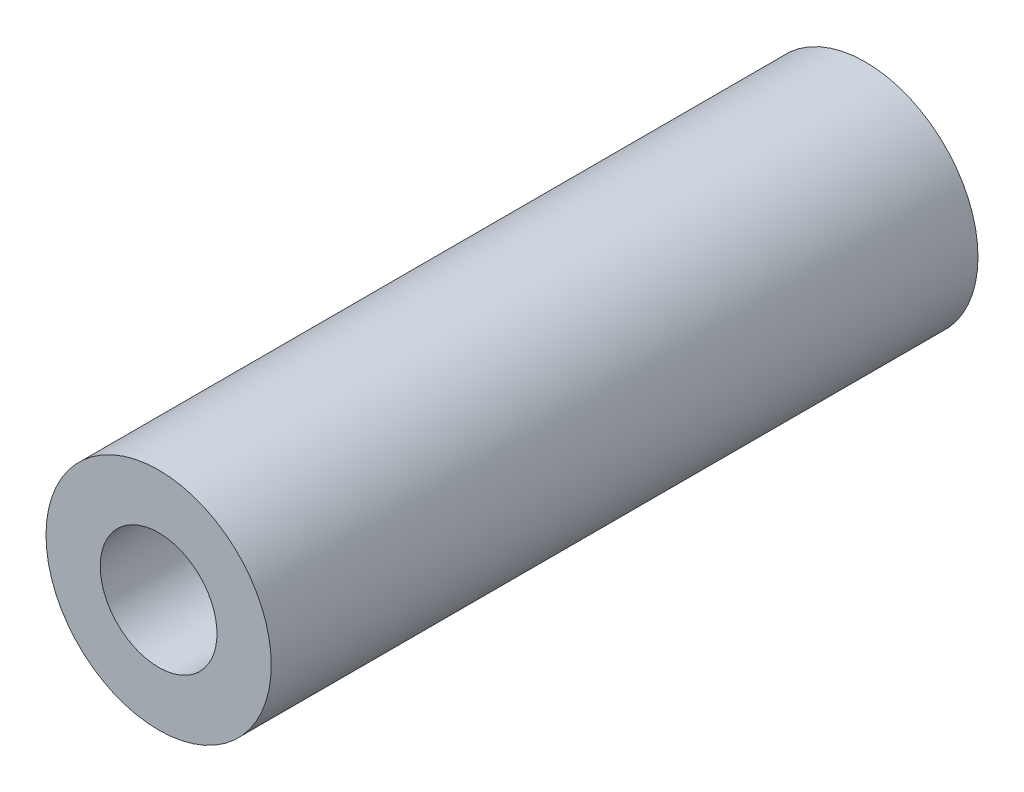
ISO-10303-21;
HEADER;
FILE_DESCRIPTION(('STEP AP214'),'2;1');
FILE_NAME('part.step','',(''),(''),'','','');
FILE_SCHEMA(('AUTOMOTIVE_DESIGN { 1 0 10303 214 1 1 1 1 }'));
ENDSEC;
DATA;
#1=APPLICATION_CONTEXT('core data for automotive mechanical design processes');
#2=APPLICATION_PROTOCOL_DEFINITION('international standard','automotive_design',2000,#1);
#3=PRODUCT_CONTEXT('',#1,'mechanical');
#4=PRODUCT('Part','Part','',(#3));
#5=PRODUCT_RELATED_PRODUCT_CATEGORY('part','',(#4));
#6=PRODUCT_DEFINITION_FORMATION('','',#4);
#7=PRODUCT_DEFINITION_CONTEXT('part definition',#1,'design');
#8=PRODUCT_DEFINITION('design','',#6,#7);
#9=PRODUCT_DEFINITION_SHAPE('','',#8);
#10=(LENGTH_UNIT() NAMED_UNIT(*) SI_UNIT(.MILLI.,.METRE.));
#11=(NAMED_UNIT(*) PLANE_ANGLE_UNIT() SI_UNIT($,.RADIAN.));
#12=(NAMED_UNIT(*) SI_UNIT($,.STERADIAN.) SOLID_ANGLE_UNIT());
#13=UNCERTAINTY_MEASURE_WITH_UNIT(LENGTH_MEASURE(1.E-05),#10,'distance_accuracy_value','');
#14=(GEOMETRIC_REPRESENTATION_CONTEXT(3) GLOBAL_UNCERTAINTY_ASSIGNED_CONTEXT((#13)) GLOBAL_UNIT_ASSIGNED_CONTEXT((#10,
#11,#12)) REPRESENTATION_CONTEXT('',''));
#15=CARTESIAN_POINT('',(0.,0.,0.));
#16=DIRECTION('',(0.,0.,1.));
#17=DIRECTION('',(1.,0.,0.));
#18=AXIS2_PLACEMENT_3D('',#15,#16,#17);
#19=CARTESIAN_POINT('',(0.,0.,19.84375));
#20=DIRECTION('',(0.,0.,-1.));
#21=DIRECTION('',(-1.,0.,0.));
#22=AXIS2_PLACEMENT_3D('',#19,#20,#21);
#23=CYLINDRICAL_SURFACE('',#22,3.2766);
#24=CARTESIAN_POINT('',(0.,0.,-19.84375));
#25=DIRECTION('',(0.,0.,-1.));
#26=DIRECTION('',(-1.,0.,0.));
#27=AXIS2_PLACEMENT_3D('',#24,#25,#26);
#28=CIRCLE('',#27,3.2766);
#29=CARTESIAN_POINT('',(-3.2766,0.,-19.84375));
#30=VERTEX_POINT('',#29);
#31=EDGE_CURVE('E27',#30,#30,#28,.T.);
#32=ORIENTED_EDGE('',*,*,#31,.T.);
#33=EDGE_LOOP('',(#32));
#34=FACE_BOUND('',#33,.T.);
#35=CARTESIAN_POINT('',(0.,0.,19.84375));
#36=DIRECTION('',(0.,0.,-1.));
#37=DIRECTION('',(-1.,0.,0.));
#38=AXIS2_PLACEMENT_3D('',#35,#36,#37);
#39=CIRCLE('',#38,3.2766);
#40=CARTESIAN_POINT('',(-3.2766,0.,19.84375));
#41=VERTEX_POINT('',#40);
#42=EDGE_CURVE('E18',#41,#41,#39,.T.);
#43=ORIENTED_EDGE('',*,*,#42,.F.);
#44=EDGE_LOOP('',(#43));
#45=FACE_BOUND('',#44,.T.);
#46=ADVANCED_FACE('F15',(#34,#45),#23,.F.);
#47=CARTESIAN_POINT('',(0.,0.,19.84375));
#48=DIRECTION('',(0.,0.,1.));
#49=DIRECTION('',(1.,0.,0.));
#50=AXIS2_PLACEMENT_3D('',#47,#48,#49);
#51=PLANE('',#50);
#52=ORIENTED_EDGE('',*,*,#42,.T.);
#53=EDGE_LOOP('',(#52));
#54=FACE_BOUND('',#53,.T.);
#55=CARTESIAN_POINT('',(0.,0.,19.84375));
#56=DIRECTION('',(0.,0.,-1.));
#57=DIRECTION('',(-1.,0.,0.));
#58=AXIS2_PLACEMENT_3D('',#55,#56,#57);
#59=CIRCLE('',#58,6.3246);
#60=CARTESIAN_POINT('',(-6.3246,0.,19.84375));
#61=VERTEX_POINT('',#60);
#62=EDGE_CURVE('E22',#61,#61,#59,.T.);
#63=ORIENTED_EDGE('',*,*,#62,.F.);
#64=EDGE_LOOP('',(#63));
#65=FACE_BOUND('',#64,.T.);
#66=ADVANCED_FACE('F35',(#54,#65),#51,.T.);
#67=CARTESIAN_POINT('',(0.,0.,-19.84375));
#68=DIRECTION('',(0.,0.,1.));
#69=DIRECTION('',(1.,0.,0.));
#70=AXIS2_PLACEMENT_3D('',#67,#68,#69);
#71=PLANE('',#70);
#72=ORIENTED_EDGE('',*,*,#31,.F.);
#73=EDGE_LOOP('',(#72));
#74=FACE_BOUND('',#73,.T.);
#75=CARTESIAN_POINT('',(0.,0.,-19.84375));
#76=DIRECTION('',(0.,0.,-1.));
#77=DIRECTION('',(-1.,0.,0.));
#78=AXIS2_PLACEMENT_3D('',#75,#76,#77);
#79=CIRCLE('',#78,6.3246);
#80=CARTESIAN_POINT('',(-6.3246,0.,-19.84375));
#81=VERTEX_POINT('',#80);
#82=EDGE_CURVE('E10',#81,#81,#79,.F.);
#83=ORIENTED_EDGE('',*,*,#82,.F.);
#84=EDGE_LOOP('',(#83));
#85=FACE_BOUND('',#84,.T.);
#86=ADVANCED_FACE('F43',(#74,#85),#71,.F.);
#87=CARTESIAN_POINT('',(0.,0.,19.84375));
#88=DIRECTION('',(0.,0.,-1.));
#89=DIRECTION('',(-1.,0.,0.));
#90=AXIS2_PLACEMENT_3D('',#87,#88,#89);
#91=CYLINDRICAL_SURFACE('',#90,6.3246);
#92=ORIENTED_EDGE('',*,*,#82,.T.);
#93=EDGE_LOOP('',(#92));
#94=FACE_BOUND('',#93,.T.);
#95=ORIENTED_EDGE('',*,*,#62,.T.);
#96=EDGE_LOOP('',(#95));
#97=FACE_BOUND('',#96,.T.);
#98=ADVANCED_FACE('F44',(#94,#97),#91,.T.);
#99=CLOSED_SHELL('',(#46,#66,#86,#98));
#100=MANIFOLD_SOLID_BREP('B1',#99);
#101=ADVANCED_BREP_SHAPE_REPRESENTATION('',(#18,#100),#14);
#102=SHAPE_DEFINITION_REPRESENTATION(#9,#101);
ENDSEC;
END-ISO-10303-21;
